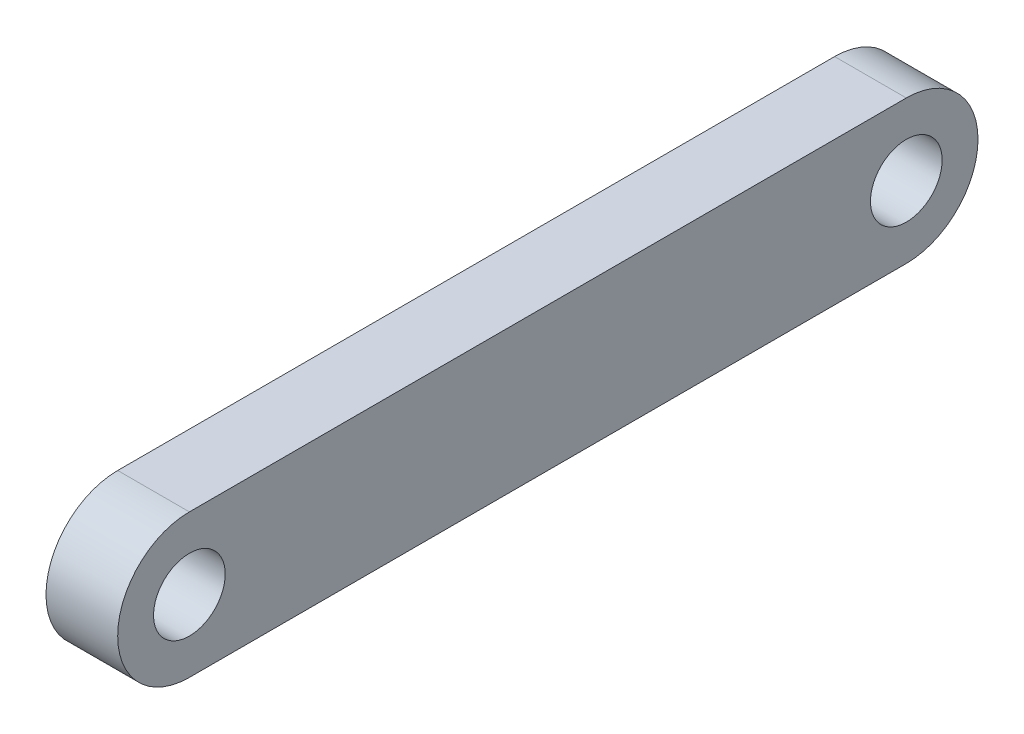
ISO-10303-21;
HEADER;
FILE_DESCRIPTION(('STEP AP214'),'2;1');
FILE_NAME('part.step','',(''),(''),'','','');
FILE_SCHEMA(('AUTOMOTIVE_DESIGN { 1 0 10303 214 1 1 1 1 }'));
ENDSEC;
DATA;
#1=APPLICATION_CONTEXT('core data for automotive mechanical design processes');
#2=APPLICATION_PROTOCOL_DEFINITION('international standard','automotive_design',2000,#1);
#3=PRODUCT_CONTEXT('',#1,'mechanical');
#4=PRODUCT('Part','Part','',(#3));
#5=PRODUCT_RELATED_PRODUCT_CATEGORY('part','',(#4));
#6=PRODUCT_DEFINITION_FORMATION('','',#4);
#7=PRODUCT_DEFINITION_CONTEXT('part definition',#1,'design');
#8=PRODUCT_DEFINITION('design','',#6,#7);
#9=PRODUCT_DEFINITION_SHAPE('','',#8);
#10=(LENGTH_UNIT() NAMED_UNIT(*) SI_UNIT(.MILLI.,.METRE.));
#11=(NAMED_UNIT(*) PLANE_ANGLE_UNIT() SI_UNIT($,.RADIAN.));
#12=(NAMED_UNIT(*) SI_UNIT($,.STERADIAN.) SOLID_ANGLE_UNIT());
#13=UNCERTAINTY_MEASURE_WITH_UNIT(LENGTH_MEASURE(1.E-05),#10,'distance_accuracy_value','');
#14=(GEOMETRIC_REPRESENTATION_CONTEXT(3) GLOBAL_UNCERTAINTY_ASSIGNED_CONTEXT((#13)) GLOBAL_UNIT_ASSIGNED_CONTEXT((#10,
#11,#12)) REPRESENTATION_CONTEXT('',''));
#15=CARTESIAN_POINT('',(0.,0.,0.));
#16=DIRECTION('',(0.,0.,1.));
#17=DIRECTION('',(1.,0.,0.));
#18=AXIS2_PLACEMENT_3D('',#15,#16,#17);
#19=CARTESIAN_POINT('',(100.,0.,0.));
#20=DIRECTION('',(-1.,0.,0.));
#21=DIRECTION('',(0.,0.,1.));
#22=AXIS2_PLACEMENT_3D('',#19,#20,#21);
#23=PLANE('',#22);
#24=CARTESIAN_POINT('',(100.,0.,0.));
#25=DIRECTION('',(1.,0.,0.));
#26=DIRECTION('',(0.,0.,1.));
#27=AXIS2_PLACEMENT_3D('',#24,#25,#26);
#28=CIRCLE('',#27,100.);
#29=CARTESIAN_POINT('',(100.,99.9999999999999,0.));
#30=VERTEX_POINT('',#29);
#31=CARTESIAN_POINT('',(100.,-100.,0.));
#32=VERTEX_POINT('',#31);
#33=EDGE_CURVE('E85',#30,#32,#28,.T.);
#34=ORIENTED_EDGE('',*,*,#33,.T.);
#35=DIRECTION('',(0.,0.,-1.));
#36=VECTOR('',#35,1.);
#37=CARTESIAN_POINT('',(100.,-100.,-1000.));
#38=LINE('',#37,#36);
#39=CARTESIAN_POINT('',(100.,-100.,-1000.));
#40=VERTEX_POINT('',#39);
#41=EDGE_CURVE('E80',#32,#40,#38,.T.);
#42=ORIENTED_EDGE('',*,*,#41,.T.);
#43=CARTESIAN_POINT('',(100.,0.,-1000.));
#44=DIRECTION('',(1.,0.,0.));
#45=DIRECTION('',(0.,0.,1.));
#46=AXIS2_PLACEMENT_3D('',#43,#44,#45);
#47=CIRCLE('',#46,100.);
#48=CARTESIAN_POINT('',(100.,99.9999999999999,-1000.));
#49=VERTEX_POINT('',#48);
#50=EDGE_CURVE('E83',#40,#49,#47,.T.);
#51=ORIENTED_EDGE('',*,*,#50,.T.);
#52=DIRECTION('',(0.,0.,1.));
#53=VECTOR('',#52,1.);
#54=CARTESIAN_POINT('',(100.,99.9999999999999,0.));
#55=LINE('',#54,#53);
#56=EDGE_CURVE('E50',#49,#30,#55,.T.);
#57=ORIENTED_EDGE('',*,*,#56,.T.);
#58=EDGE_LOOP('',(#34,#42,#51,#57));
#59=FACE_BOUND('',#58,.T.);
#60=CARTESIAN_POINT('',(100.,0.,0.));
#61=DIRECTION('',(1.,0.,0.));
#62=DIRECTION('',(0.,0.,-1.));
#63=AXIS2_PLACEMENT_3D('',#60,#61,#62);
#64=CIRCLE('',#63,50.);
#65=CARTESIAN_POINT('',(100.,0.,-50.));
#66=VERTEX_POINT('',#65);
#67=EDGE_CURVE('E100',#66,#66,#64,.T.);
#68=ORIENTED_EDGE('',*,*,#67,.F.);
#69=EDGE_LOOP('',(#68));
#70=FACE_BOUND('',#69,.T.);
#71=CARTESIAN_POINT('',(100.,0.,-1000.));
#72=DIRECTION('',(1.,0.,0.));
#73=DIRECTION('',(0.,0.,-1.));
#74=AXIS2_PLACEMENT_3D('',#71,#72,#73);
#75=CIRCLE('',#74,50.);
#76=CARTESIAN_POINT('',(100.,0.,-1050.));
#77=VERTEX_POINT('',#76);
#78=EDGE_CURVE('E115',#77,#77,#75,.T.);
#79=ORIENTED_EDGE('',*,*,#78,.F.);
#80=EDGE_LOOP('',(#79));
#81=FACE_BOUND('',#80,.T.);
#82=ADVANCED_FACE('F33',(#59,#70,#81),#23,.F.);
#83=CARTESIAN_POINT('',(0.,0.,0.));
#84=DIRECTION('',(-1.,0.,0.));
#85=DIRECTION('',(0.,0.,1.));
#86=AXIS2_PLACEMENT_3D('',#83,#84,#85);
#87=PLANE('',#86);
#88=CARTESIAN_POINT('',(0.,0.,0.));
#89=DIRECTION('',(1.,0.,0.));
#90=DIRECTION('',(0.,0.,-1.));
#91=AXIS2_PLACEMENT_3D('',#88,#89,#90);
#92=CIRCLE('',#91,50.);
#93=CARTESIAN_POINT('',(0.,0.,-50.));
#94=VERTEX_POINT('',#93);
#95=EDGE_CURVE('E112',#94,#94,#92,.T.);
#96=ORIENTED_EDGE('',*,*,#95,.T.);
#97=EDGE_LOOP('',(#96));
#98=FACE_BOUND('',#97,.T.);
#99=CARTESIAN_POINT('',(0.,0.,0.));
#100=DIRECTION('',(1.,0.,0.));
#101=DIRECTION('',(0.,0.,1.));
#102=AXIS2_PLACEMENT_3D('',#99,#100,#101);
#103=CIRCLE('',#102,100.);
#104=CARTESIAN_POINT('',(0.,99.9999999999999,0.));
#105=VERTEX_POINT('',#104);
#106=CARTESIAN_POINT('',(0.,-100.,0.));
#107=VERTEX_POINT('',#106);
#108=EDGE_CURVE('E97',#105,#107,#103,.T.);
#109=ORIENTED_EDGE('',*,*,#108,.F.);
#110=DIRECTION('',(0.,0.,1.));
#111=VECTOR('',#110,1.);
#112=CARTESIAN_POINT('',(0.,99.9999999999999,0.));
#113=LINE('',#112,#111);
#114=CARTESIAN_POINT('',(0.,99.9999999999999,-1000.));
#115=VERTEX_POINT('',#114);
#116=EDGE_CURVE('E73',#115,#105,#113,.T.);
#117=ORIENTED_EDGE('',*,*,#116,.F.);
#118=CARTESIAN_POINT('',(0.,0.,-1000.));
#119=DIRECTION('',(1.,0.,0.));
#120=DIRECTION('',(0.,0.,1.));
#121=AXIS2_PLACEMENT_3D('',#118,#119,#120);
#122=CIRCLE('',#121,100.);
#123=CARTESIAN_POINT('',(0.,-100.,-1000.));
#124=VERTEX_POINT('',#123);
#125=EDGE_CURVE('E67',#124,#115,#122,.T.);
#126=ORIENTED_EDGE('',*,*,#125,.F.);
#127=DIRECTION('',(0.,0.,-1.));
#128=VECTOR('',#127,1.);
#129=CARTESIAN_POINT('',(0.,-100.,-1000.));
#130=LINE('',#129,#128);
#131=EDGE_CURVE('E89',#107,#124,#130,.T.);
#132=ORIENTED_EDGE('',*,*,#131,.F.);
#133=EDGE_LOOP('',(#109,#117,#126,#132));
#134=FACE_BOUND('',#133,.T.);
#135=CARTESIAN_POINT('',(0.,0.,-1000.));
#136=DIRECTION('',(1.,0.,0.));
#137=DIRECTION('',(0.,0.,-1.));
#138=AXIS2_PLACEMENT_3D('',#135,#136,#137);
#139=CIRCLE('',#138,50.);
#140=CARTESIAN_POINT('',(0.,0.,-1050.));
#141=VERTEX_POINT('',#140);
#142=EDGE_CURVE('E118',#141,#141,#139,.T.);
#143=ORIENTED_EDGE('',*,*,#142,.T.);
#144=EDGE_LOOP('',(#143));
#145=FACE_BOUND('',#144,.T.);
#146=ADVANCED_FACE('F108',(#98,#134,#145),#87,.T.);
#147=CARTESIAN_POINT('',(100.,0.,0.));
#148=DIRECTION('',(-1.,0.,0.));
#149=DIRECTION('',(0.,0.,1.));
#150=AXIS2_PLACEMENT_3D('',#147,#148,#149);
#151=CYLINDRICAL_SURFACE('',#150,100.);
#152=ORIENTED_EDGE('',*,*,#108,.T.);
#153=DIRECTION('',(-1.,0.,0.));
#154=VECTOR('',#153,1.);
#155=CARTESIAN_POINT('',(100.,-100.,0.));
#156=LINE('',#155,#154);
#157=EDGE_CURVE('E11',#32,#107,#156,.T.);
#158=ORIENTED_EDGE('',*,*,#157,.F.);
#159=ORIENTED_EDGE('',*,*,#33,.F.);
#160=DIRECTION('',(-1.,0.,0.));
#161=VECTOR('',#160,1.);
#162=CARTESIAN_POINT('',(100.,99.9999999999999,0.));
#163=LINE('',#162,#161);
#164=EDGE_CURVE('E93',#30,#105,#163,.T.);
#165=ORIENTED_EDGE('',*,*,#164,.T.);
#166=EDGE_LOOP('',(#152,#158,#159,#165));
#167=FACE_BOUND('',#166,.T.);
#168=ADVANCED_FACE('F35',(#167),#151,.T.);
#169=CARTESIAN_POINT('',(100.,-100.,-1000.));
#170=DIRECTION('',(0.,1.,0.));
#171=DIRECTION('',(0.,0.,1.));
#172=AXIS2_PLACEMENT_3D('',#169,#170,#171);
#173=PLANE('',#172);
#174=ORIENTED_EDGE('',*,*,#131,.T.);
#175=DIRECTION('',(-1.,0.,0.));
#176=VECTOR('',#175,1.);
#177=CARTESIAN_POINT('',(100.,-100.,-1000.));
#178=LINE('',#177,#176);
#179=EDGE_CURVE('E42',#40,#124,#178,.T.);
#180=ORIENTED_EDGE('',*,*,#179,.F.);
#181=ORIENTED_EDGE('',*,*,#41,.F.);
#182=ORIENTED_EDGE('',*,*,#157,.T.);
#183=EDGE_LOOP('',(#174,#180,#181,#182));
#184=FACE_BOUND('',#183,.T.);
#185=ADVANCED_FACE('F88',(#184),#173,.F.);
#186=CARTESIAN_POINT('',(100.,0.,-1000.));
#187=DIRECTION('',(-1.,0.,0.));
#188=DIRECTION('',(0.,0.,1.));
#189=AXIS2_PLACEMENT_3D('',#186,#187,#188);
#190=CYLINDRICAL_SURFACE('',#189,100.);
#191=ORIENTED_EDGE('',*,*,#125,.T.);
#192=DIRECTION('',(-1.,0.,0.));
#193=VECTOR('',#192,1.);
#194=CARTESIAN_POINT('',(100.,99.9999999999999,-1000.));
#195=LINE('',#194,#193);
#196=EDGE_CURVE('E90',#49,#115,#195,.T.);
#197=ORIENTED_EDGE('',*,*,#196,.F.);
#198=ORIENTED_EDGE('',*,*,#50,.F.);
#199=ORIENTED_EDGE('',*,*,#179,.T.);
#200=EDGE_LOOP('',(#191,#197,#198,#199));
#201=FACE_BOUND('',#200,.T.);
#202=ADVANCED_FACE('F91',(#201),#190,.T.);
#203=CARTESIAN_POINT('',(100.,99.9999999999999,0.));
#204=DIRECTION('',(0.,-1.,0.));
#205=DIRECTION('',(0.,0.,-1.));
#206=AXIS2_PLACEMENT_3D('',#203,#204,#205);
#207=PLANE('',#206);
#208=ORIENTED_EDGE('',*,*,#116,.T.);
#209=ORIENTED_EDGE('',*,*,#164,.F.);
#210=ORIENTED_EDGE('',*,*,#56,.F.);
#211=ORIENTED_EDGE('',*,*,#196,.T.);
#212=EDGE_LOOP('',(#208,#209,#210,#211));
#213=FACE_BOUND('',#212,.T.);
#214=ADVANCED_FACE('F105',(#213),#207,.F.);
#215=CARTESIAN_POINT('',(100.,0.,0.));
#216=DIRECTION('',(-1.,0.,0.));
#217=DIRECTION('',(0.,0.,1.));
#218=AXIS2_PLACEMENT_3D('',#215,#216,#217);
#219=CYLINDRICAL_SURFACE('',#218,50.);
#220=ORIENTED_EDGE('',*,*,#67,.T.);
#221=EDGE_LOOP('',(#220));
#222=FACE_BOUND('',#221,.T.);
#223=ORIENTED_EDGE('',*,*,#95,.F.);
#224=EDGE_LOOP('',(#223));
#225=FACE_BOUND('',#224,.T.);
#226=ADVANCED_FACE('F135',(#222,#225),#219,.F.);
#227=CARTESIAN_POINT('',(100.,0.,-1000.));
#228=DIRECTION('',(-1.,0.,0.));
#229=DIRECTION('',(0.,0.,1.));
#230=AXIS2_PLACEMENT_3D('',#227,#228,#229);
#231=CYLINDRICAL_SURFACE('',#230,50.);
#232=ORIENTED_EDGE('',*,*,#78,.T.);
#233=EDGE_LOOP('',(#232));
#234=FACE_BOUND('',#233,.T.);
#235=ORIENTED_EDGE('',*,*,#142,.F.);
#236=EDGE_LOOP('',(#235));
#237=FACE_BOUND('',#236,.T.);
#238=ADVANCED_FACE('F124',(#234,#237),#231,.F.);
#239=CLOSED_SHELL('',(#82,#146,#168,#185,#202,#214,#226,#238));
#240=MANIFOLD_SOLID_BREP('B2',#239);
#241=ADVANCED_BREP_SHAPE_REPRESENTATION('',(#18,#240),#14);
#242=SHAPE_DEFINITION_REPRESENTATION(#9,#241);
ENDSEC;
END-ISO-10303-21;
